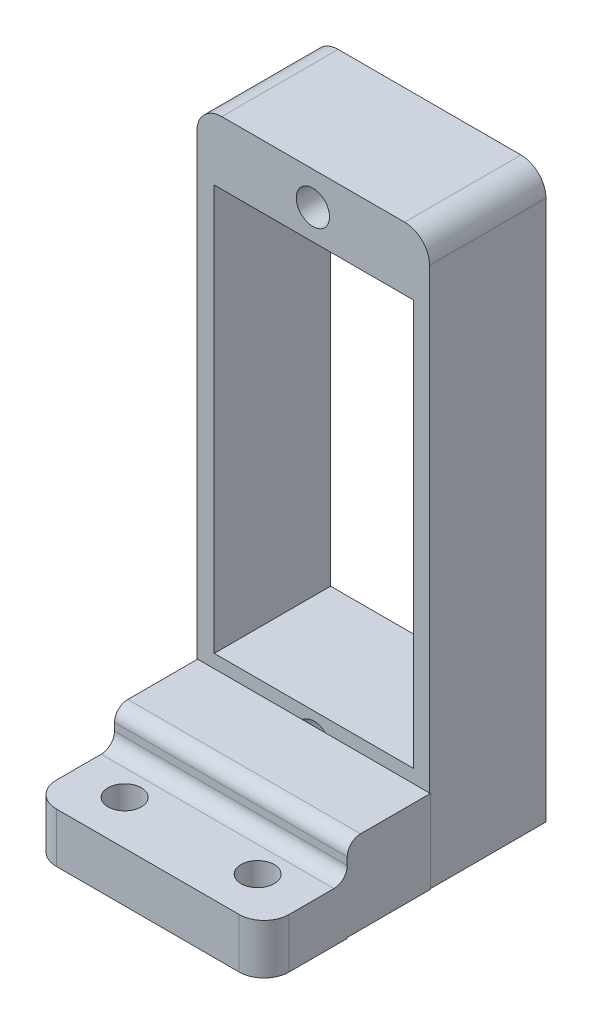
ISO-10303-21;
HEADER;
FILE_DESCRIPTION(('STEP AP214'),'2;1');
FILE_NAME('part.step','',(''),(''),'','','');
FILE_SCHEMA(('AUTOMOTIVE_DESIGN { 1 0 10303 214 1 1 1 1 }'));
ENDSEC;
DATA;
#1=APPLICATION_CONTEXT('core data for automotive mechanical design processes');
#2=APPLICATION_PROTOCOL_DEFINITION('international standard','automotive_design',2000,#1);
#3=PRODUCT_CONTEXT('',#1,'mechanical');
#4=PRODUCT('Part','Part','',(#3));
#5=PRODUCT_RELATED_PRODUCT_CATEGORY('part','',(#4));
#6=PRODUCT_DEFINITION_FORMATION('','',#4);
#7=PRODUCT_DEFINITION_CONTEXT('part definition',#1,'design');
#8=PRODUCT_DEFINITION('design','',#6,#7);
#9=PRODUCT_DEFINITION_SHAPE('','',#8);
#10=(LENGTH_UNIT() NAMED_UNIT(*) SI_UNIT(.MILLI.,.METRE.));
#11=(NAMED_UNIT(*) PLANE_ANGLE_UNIT() SI_UNIT($,.RADIAN.));
#12=(NAMED_UNIT(*) SI_UNIT($,.STERADIAN.) SOLID_ANGLE_UNIT());
#13=UNCERTAINTY_MEASURE_WITH_UNIT(LENGTH_MEASURE(1.E-05),#10,'distance_accuracy_value','');
#14=(GEOMETRIC_REPRESENTATION_CONTEXT(3) GLOBAL_UNCERTAINTY_ASSIGNED_CONTEXT((#13)) GLOBAL_UNIT_ASSIGNED_CONTEXT((#10,
#11,#12)) REPRESENTATION_CONTEXT('',''));
#15=CARTESIAN_POINT('',(0.,0.,0.));
#16=DIRECTION('',(0.,0.,1.));
#17=DIRECTION('',(1.,0.,0.));
#18=AXIS2_PLACEMENT_3D('',#15,#16,#17);
#19=CARTESIAN_POINT('',(231.952994654938,496.99061481828,32.));
#20=DIRECTION('',(1.,0.,0.));
#21=DIRECTION('',(0.,0.,-1.));
#22=AXIS2_PLACEMENT_3D('',#19,#20,#21);
#23=PLANE('',#22);
#24=DIRECTION('',(0.,-1.,0.));
#25=VECTOR('',#24,1.);
#26=CARTESIAN_POINT('',(231.952994654938,496.99061481828,32.));
#27=LINE('',#26,#25);
#28=CARTESIAN_POINT('',(231.952994654938,495.49061481828,32.));
#29=VERTEX_POINT('',#28);
#30=CARTESIAN_POINT('',(231.952994654938,462.99061481828,32.));
#31=VERTEX_POINT('',#30);
#32=EDGE_CURVE('E427',#29,#31,#27,.T.);
#33=ORIENTED_EDGE('',*,*,#32,.F.);
#34=DIRECTION('',(0.,0.,-1.));
#35=VECTOR('',#34,1.);
#36=CARTESIAN_POINT('',(231.952994654938,495.49061481828,32.));
#37=LINE('',#36,#35);
#38=CARTESIAN_POINT('',(231.952994654938,495.49061481828,25.));
#39=VERTEX_POINT('',#38);
#40=EDGE_CURVE('E282',#29,#39,#37,.T.);
#41=ORIENTED_EDGE('',*,*,#40,.T.);
#42=DIRECTION('',(0.,-1.,0.));
#43=VECTOR('',#42,1.);
#44=CARTESIAN_POINT('',(231.952994654938,496.99061481828,25.));
#45=LINE('',#44,#43);
#46=CARTESIAN_POINT('',(231.952994654938,462.99061481828,25.));
#47=VERTEX_POINT('',#46);
#48=EDGE_CURVE('E414',#39,#47,#45,.T.);
#49=ORIENTED_EDGE('',*,*,#48,.T.);
#50=DIRECTION('',(0.,0.,-1.));
#51=VECTOR('',#50,1.);
#52=CARTESIAN_POINT('',(231.952994654938,462.99061481828,32.));
#53=LINE('',#52,#51);
#54=EDGE_CURVE('E246',#31,#47,#53,.T.);
#55=ORIENTED_EDGE('',*,*,#54,.F.);
#56=EDGE_LOOP('',(#33,#41,#49,#55));
#57=FACE_BOUND('',#56,.T.);
#58=ADVANCED_FACE('F39',(#57),#23,.F.);
#59=CARTESIAN_POINT('',(231.952994654938,462.99061481828,32.));
#60=DIRECTION('',(0.,1.,0.));
#61=DIRECTION('',(0.,0.,1.));
#62=AXIS2_PLACEMENT_3D('',#59,#60,#61);
#63=PLANE('',#62);
#64=DIRECTION('',(1.,0.,0.));
#65=VECTOR('',#64,1.);
#66=CARTESIAN_POINT('',(231.952994654938,462.99061481828,25.));
#67=LINE('',#66,#65);
#68=CARTESIAN_POINT('',(245.952994654938,462.99061481828,25.));
#69=VERTEX_POINT('',#68);
#70=EDGE_CURVE('E417',#47,#69,#67,.T.);
#71=ORIENTED_EDGE('',*,*,#70,.T.);
#72=DIRECTION('',(0.,0.,-1.));
#73=VECTOR('',#72,1.);
#74=CARTESIAN_POINT('',(245.952994654938,462.99061481828,32.));
#75=LINE('',#74,#73);
#76=CARTESIAN_POINT('',(245.952994654938,462.99061481828,32.));
#77=VERTEX_POINT('',#76);
#78=EDGE_CURVE('E250',#77,#69,#75,.T.);
#79=ORIENTED_EDGE('',*,*,#78,.F.);
#80=DIRECTION('',(1.,0.,0.));
#81=VECTOR('',#80,1.);
#82=CARTESIAN_POINT('',(231.952994654938,462.99061481828,32.));
#83=LINE('',#82,#81);
#84=EDGE_CURVE('E407',#31,#77,#83,.T.);
#85=ORIENTED_EDGE('',*,*,#84,.F.);
#86=ORIENTED_EDGE('',*,*,#54,.T.);
#87=EDGE_LOOP('',(#71,#79,#85,#86));
#88=FACE_BOUND('',#87,.T.);
#89=ADVANCED_FACE('F561',(#88),#63,.F.);
#90=CARTESIAN_POINT('',(245.952994654938,496.99061481828,32.));
#91=DIRECTION('',(-1.,0.,0.));
#92=DIRECTION('',(0.,0.,1.));
#93=AXIS2_PLACEMENT_3D('',#90,#91,#92);
#94=PLANE('',#93);
#95=DIRECTION('',(0.,1.,0.));
#96=VECTOR('',#95,1.);
#97=CARTESIAN_POINT('',(245.952994654938,496.99061481828,25.));
#98=LINE('',#97,#96);
#99=CARTESIAN_POINT('',(245.952994654938,495.49061481828,25.));
#100=VERTEX_POINT('',#99);
#101=EDGE_CURVE('E421',#69,#100,#98,.T.);
#102=ORIENTED_EDGE('',*,*,#101,.T.);
#103=DIRECTION('',(0.,0.,-1.));
#104=VECTOR('',#103,1.);
#105=CARTESIAN_POINT('',(245.952994654938,495.49061481828,32.));
#106=LINE('',#105,#104);
#107=CARTESIAN_POINT('',(245.952994654938,495.49061481828,32.));
#108=VERTEX_POINT('',#107);
#109=EDGE_CURVE('E305',#100,#108,#106,.F.);
#110=ORIENTED_EDGE('',*,*,#109,.T.);
#111=DIRECTION('',(0.,1.,0.));
#112=VECTOR('',#111,1.);
#113=CARTESIAN_POINT('',(245.952994654938,496.99061481828,32.));
#114=LINE('',#113,#112);
#115=CARTESIAN_POINT('',(245.952994654938,468.,32.));
#116=VERTEX_POINT('',#115);
#117=EDGE_CURVE('E403',#116,#108,#114,.T.);
#118=ORIENTED_EDGE('',*,*,#117,.F.);
#119=CARTESIAN_POINT('',(245.952994654938,463.,32.));
#120=VERTEX_POINT('',#119);
#121=EDGE_CURVE('E398',#120,#116,#114,.T.);
#122=ORIENTED_EDGE('',*,*,#121,.F.);
#123=EDGE_CURVE('E402',#77,#120,#114,.T.);
#124=ORIENTED_EDGE('',*,*,#123,.F.);
#125=ORIENTED_EDGE('',*,*,#78,.T.);
#126=EDGE_LOOP('',(#102,#110,#118,#122,#124,#125));
#127=FACE_BOUND('',#126,.T.);
#128=ADVANCED_FACE('F567',(#127),#94,.F.);
#129=CARTESIAN_POINT('',(231.952994654938,496.99061481828,32.));
#130=DIRECTION('',(0.,-1.,0.));
#131=DIRECTION('',(0.,0.,-1.));
#132=AXIS2_PLACEMENT_3D('',#129,#130,#131);
#133=PLANE('',#132);
#134=DIRECTION('',(-1.,0.,0.));
#135=VECTOR('',#134,1.);
#136=CARTESIAN_POINT('',(231.952994654938,496.99061481828,25.));
#137=LINE('',#136,#135);
#138=CARTESIAN_POINT('',(244.452994654938,496.99061481828,25.));
#139=VERTEX_POINT('',#138);
#140=CARTESIAN_POINT('',(233.452994654938,496.99061481828,25.));
#141=VERTEX_POINT('',#140);
#142=EDGE_CURVE('E424',#139,#141,#137,.T.);
#143=ORIENTED_EDGE('',*,*,#142,.T.);
#144=DIRECTION('',(0.,0.,-1.));
#145=VECTOR('',#144,1.);
#146=CARTESIAN_POINT('',(233.452994654938,496.99061481828,32.));
#147=LINE('',#146,#145);
#148=CARTESIAN_POINT('',(233.452994654938,496.99061481828,32.));
#149=VERTEX_POINT('',#148);
#150=EDGE_CURVE('E296',#141,#149,#147,.F.);
#151=ORIENTED_EDGE('',*,*,#150,.T.);
#152=DIRECTION('',(-1.,0.,0.));
#153=VECTOR('',#152,1.);
#154=CARTESIAN_POINT('',(231.952994654938,496.99061481828,32.));
#155=LINE('',#154,#153);
#156=CARTESIAN_POINT('',(244.452994654938,496.99061481828,32.));
#157=VERTEX_POINT('',#156);
#158=EDGE_CURVE('E257',#157,#149,#155,.T.);
#159=ORIENTED_EDGE('',*,*,#158,.F.);
#160=DIRECTION('',(0.,0.,-1.));
#161=VECTOR('',#160,1.);
#162=CARTESIAN_POINT('',(244.452994654938,496.99061481828,32.));
#163=LINE('',#162,#161);
#164=EDGE_CURVE('E292',#157,#139,#163,.T.);
#165=ORIENTED_EDGE('',*,*,#164,.T.);
#166=EDGE_LOOP('',(#143,#151,#159,#165));
#167=FACE_BOUND('',#166,.T.);
#168=ADVANCED_FACE('F639',(#167),#133,.F.);
#169=CARTESIAN_POINT('',(0.,0.,32.));
#170=DIRECTION('',(0.,0.,1.));
#171=DIRECTION('',(1.,0.,0.));
#172=AXIS2_PLACEMENT_3D('',#169,#170,#171);
#173=PLANE('',#172);
#174=CARTESIAN_POINT('',(238.996354520083,467.272454622162,32.));
#175=DIRECTION('',(0.,0.,-1.));
#176=DIRECTION('',(-1.,0.,0.));
#177=AXIS2_PLACEMENT_3D('',#174,#175,#176);
#178=CIRCLE('',#177,0.999999999999998);
#179=CARTESIAN_POINT('',(238.310294957664,468.,32.));
#180=VERTEX_POINT('',#179);
#181=CARTESIAN_POINT('',(239.682414082501,468.,32.));
#182=VERTEX_POINT('',#181);
#183=EDGE_CURVE('E54',#180,#182,#178,.T.);
#184=ORIENTED_EDGE('',*,*,#183,.T.);
#185=DIRECTION('',(-1.,0.,0.));
#186=VECTOR('',#185,1.);
#187=CARTESIAN_POINT('',(232.,468.,32.));
#188=LINE('',#187,#186);
#189=EDGE_CURVE('E207',#116,#182,#188,.T.);
#190=ORIENTED_EDGE('',*,*,#189,.F.);
#191=ORIENTED_EDGE('',*,*,#117,.T.);
#192=CARTESIAN_POINT('',(244.452994654938,495.49061481828,32.));
#193=DIRECTION('',(0.,0.,1.));
#194=DIRECTION('',(1.,0.,0.));
#195=AXIS2_PLACEMENT_3D('',#192,#193,#194);
#196=CIRCLE('',#195,1.5);
#197=EDGE_CURVE('E299',#108,#157,#196,.T.);
#198=ORIENTED_EDGE('',*,*,#197,.T.);
#199=ORIENTED_EDGE('',*,*,#158,.T.);
#200=CARTESIAN_POINT('',(233.452994654938,495.49061481828,32.));
#201=DIRECTION('',(0.,0.,1.));
#202=DIRECTION('',(1.,0.,0.));
#203=AXIS2_PLACEMENT_3D('',#200,#201,#202);
#204=CIRCLE('',#203,1.5);
#205=EDGE_CURVE('E302',#149,#29,#204,.T.);
#206=ORIENTED_EDGE('',*,*,#205,.T.);
#207=ORIENTED_EDGE('',*,*,#32,.T.);
#208=ORIENTED_EDGE('',*,*,#84,.T.);
#209=ORIENTED_EDGE('',*,*,#123,.T.);
#210=DIRECTION('',(1.,0.,0.));
#211=VECTOR('',#210,1.);
#212=CARTESIAN_POINT('',(232.,463.,32.));
#213=LINE('',#212,#211);
#214=CARTESIAN_POINT('',(232.,463.,32.));
#215=VERTEX_POINT('',#214);
#216=EDGE_CURVE('E244',#215,#120,#213,.T.);
#217=ORIENTED_EDGE('',*,*,#216,.F.);
#218=DIRECTION('',(0.,-1.,0.));
#219=VECTOR('',#218,1.);
#220=CARTESIAN_POINT('',(232.,468.,32.));
#221=LINE('',#220,#219);
#222=CARTESIAN_POINT('',(232.,468.,32.));
#223=VERTEX_POINT('',#222);
#224=EDGE_CURVE('E365',#223,#215,#221,.T.);
#225=ORIENTED_EDGE('',*,*,#224,.F.);
#226=EDGE_CURVE('E208',#180,#223,#188,.T.);
#227=ORIENTED_EDGE('',*,*,#226,.F.);
#228=EDGE_LOOP('',(#184,#190,#191,#198,#199,#206,#207,#208,#209,#217,#225,#227));
#229=FACE_BOUND('',#228,.T.);
#230=DIRECTION('',(0.,-1.,0.));
#231=VECTOR('',#230,1.);
#232=CARTESIAN_POINT('',(233.,493.200012207031,32.));
#233=LINE('',#232,#231);
#234=CARTESIAN_POINT('',(233.,493.200012207031,32.));
#235=VERTEX_POINT('',#234);
#236=CARTESIAN_POINT('',(233.,468.800012207031,32.));
#237=VERTEX_POINT('',#236);
#238=EDGE_CURVE('E443',#235,#237,#233,.T.);
#239=ORIENTED_EDGE('',*,*,#238,.F.);
#240=DIRECTION('',(-1.,0.,0.));
#241=VECTOR('',#240,1.);
#242=CARTESIAN_POINT('',(233.,493.200012207031,32.));
#243=LINE('',#242,#241);
#244=CARTESIAN_POINT('',(245.,493.200012207031,32.));
#245=VERTEX_POINT('',#244);
#246=EDGE_CURVE('E457',#245,#235,#243,.T.);
#247=ORIENTED_EDGE('',*,*,#246,.F.);
#248=DIRECTION('',(0.,1.,0.));
#249=VECTOR('',#248,1.);
#250=CARTESIAN_POINT('',(245.,493.200012207031,32.));
#251=LINE('',#250,#249);
#252=CARTESIAN_POINT('',(245.,468.800012207031,32.));
#253=VERTEX_POINT('',#252);
#254=EDGE_CURVE('E462',#253,#245,#251,.T.);
#255=ORIENTED_EDGE('',*,*,#254,.F.);
#256=DIRECTION('',(1.,0.,0.));
#257=VECTOR('',#256,1.);
#258=CARTESIAN_POINT('',(233.,468.800012207031,32.));
#259=LINE('',#258,#257);
#260=EDGE_CURVE('E466',#237,#253,#259,.T.);
#261=ORIENTED_EDGE('',*,*,#260,.F.);
#262=EDGE_LOOP('',(#239,#247,#255,#261));
#263=FACE_BOUND('',#262,.T.);
#264=CARTESIAN_POINT('',(238.935079191974,495.003072258083,32.));
#265=DIRECTION('',(0.,0.,1.));
#266=DIRECTION('',(1.,0.,0.));
#267=AXIS2_PLACEMENT_3D('',#264,#265,#266);
#268=CIRCLE('',#267,0.999999999999998);
#269=CARTESIAN_POINT('',(239.935079191974,495.003072258083,32.));
#270=VERTEX_POINT('',#269);
#271=EDGE_CURVE('E435',#270,#270,#268,.T.);
#272=ORIENTED_EDGE('',*,*,#271,.F.);
#273=EDGE_LOOP('',(#272));
#274=FACE_BOUND('',#273,.T.);
#275=ADVANCED_FACE('F216',(#229,#263,#274),#173,.T.);
#276=CARTESIAN_POINT('',(0.,0.,25.));
#277=DIRECTION('',(0.,0.,1.));
#278=DIRECTION('',(1.,0.,0.));
#279=AXIS2_PLACEMENT_3D('',#276,#277,#278);
#280=PLANE('',#279);
#281=CARTESIAN_POINT('',(238.996354520083,467.272454622162,25.));
#282=DIRECTION('',(0.,0.,-1.));
#283=DIRECTION('',(-1.,0.,0.));
#284=AXIS2_PLACEMENT_3D('',#281,#282,#283);
#285=CIRCLE('',#284,0.999999999999998);
#286=CARTESIAN_POINT('',(237.996354520083,467.272454622162,25.));
#287=VERTEX_POINT('',#286);
#288=EDGE_CURVE('E213',#287,#287,#285,.T.);
#289=ORIENTED_EDGE('',*,*,#288,.F.);
#290=EDGE_LOOP('',(#289));
#291=FACE_BOUND('',#290,.T.);
#292=DIRECTION('',(-1.,0.,0.));
#293=VECTOR('',#292,1.);
#294=CARTESIAN_POINT('',(233.,493.200012207031,25.));
#295=LINE('',#294,#293);
#296=CARTESIAN_POINT('',(245.,493.200012207031,25.));
#297=VERTEX_POINT('',#296);
#298=CARTESIAN_POINT('',(233.,493.200012207031,25.));
#299=VERTEX_POINT('',#298);
#300=EDGE_CURVE('E449',#297,#299,#295,.T.);
#301=ORIENTED_EDGE('',*,*,#300,.T.);
#302=DIRECTION('',(0.,-1.,0.));
#303=VECTOR('',#302,1.);
#304=CARTESIAN_POINT('',(233.,493.200012207031,25.));
#305=LINE('',#304,#303);
#306=CARTESIAN_POINT('',(233.,468.800012207031,25.));
#307=VERTEX_POINT('',#306);
#308=EDGE_CURVE('E461',#299,#307,#305,.T.);
#309=ORIENTED_EDGE('',*,*,#308,.T.);
#310=DIRECTION('',(1.,0.,0.));
#311=VECTOR('',#310,1.);
#312=CARTESIAN_POINT('',(233.,468.800012207031,25.));
#313=LINE('',#312,#311);
#314=CARTESIAN_POINT('',(245.,468.800012207031,25.));
#315=VERTEX_POINT('',#314);
#316=EDGE_CURVE('E479',#307,#315,#313,.T.);
#317=ORIENTED_EDGE('',*,*,#316,.T.);
#318=DIRECTION('',(0.,1.,0.));
#319=VECTOR('',#318,1.);
#320=CARTESIAN_POINT('',(245.,493.200012207031,25.));
#321=LINE('',#320,#319);
#322=EDGE_CURVE('E475',#315,#297,#321,.T.);
#323=ORIENTED_EDGE('',*,*,#322,.T.);
#324=EDGE_LOOP('',(#301,#309,#317,#323));
#325=FACE_BOUND('',#324,.T.);
#326=CARTESIAN_POINT('',(238.935079191974,495.003072258083,25.));
#327=DIRECTION('',(0.,0.,1.));
#328=DIRECTION('',(1.,0.,0.));
#329=AXIS2_PLACEMENT_3D('',#326,#327,#328);
#330=CIRCLE('',#329,0.999999999999998);
#331=CARTESIAN_POINT('',(239.935079191974,495.003072258083,25.));
#332=VERTEX_POINT('',#331);
#333=EDGE_CURVE('E439',#332,#332,#330,.T.);
#334=ORIENTED_EDGE('',*,*,#333,.T.);
#335=EDGE_LOOP('',(#334));
#336=FACE_BOUND('',#335,.T.);
#337=ORIENTED_EDGE('',*,*,#48,.F.);
#338=CARTESIAN_POINT('',(233.452994654938,495.49061481828,25.));
#339=DIRECTION('',(0.,0.,1.));
#340=DIRECTION('',(1.,0.,0.));
#341=AXIS2_PLACEMENT_3D('',#338,#339,#340);
#342=CIRCLE('',#341,1.5);
#343=EDGE_CURVE('E289',#39,#141,#342,.F.);
#344=ORIENTED_EDGE('',*,*,#343,.T.);
#345=ORIENTED_EDGE('',*,*,#142,.F.);
#346=CARTESIAN_POINT('',(244.452994654938,495.49061481828,25.));
#347=DIRECTION('',(0.,0.,1.));
#348=DIRECTION('',(1.,0.,0.));
#349=AXIS2_PLACEMENT_3D('',#346,#347,#348);
#350=CIRCLE('',#349,1.5);
#351=EDGE_CURVE('E286',#139,#100,#350,.F.);
#352=ORIENTED_EDGE('',*,*,#351,.T.);
#353=ORIENTED_EDGE('',*,*,#101,.F.);
#354=ORIENTED_EDGE('',*,*,#70,.F.);
#355=EDGE_LOOP('',(#337,#344,#345,#352,#353,#354));
#356=FACE_BOUND('',#355,.T.);
#357=ADVANCED_FACE('F635',(#291,#325,#336,#356),#280,.F.);
#358=CARTESIAN_POINT('',(238.935079191974,495.003072258083,25.));
#359=DIRECTION('',(0.,0.,1.));
#360=DIRECTION('',(1.,0.,0.));
#361=AXIS2_PLACEMENT_3D('',#358,#359,#360);
#362=CYLINDRICAL_SURFACE('',#361,0.999999999999998);
#363=CARTESIAN_POINT('',(239.935079191974,495.003072258083,25.));
#364=CARTESIAN_POINT('',(239.935079191974,495.003072258083,25.0729166666667));
#365=CARTESIAN_POINT('',(239.935079191974,495.003072258083,25.1458333333333));
#366=CARTESIAN_POINT('',(239.935079191974,495.003072258083,25.2916666666667));
#367=CARTESIAN_POINT('',(239.935079191974,495.003072258083,25.3645833333333));
#368=CARTESIAN_POINT('',(239.935079191974,495.003072258083,25.5104166666667));
#369=CARTESIAN_POINT('',(239.935079191974,495.003072258083,25.5833333333333));
#370=CARTESIAN_POINT('',(239.935079191974,495.003072258083,25.7291666666667));
#371=CARTESIAN_POINT('',(239.935079191974,495.003072258083,25.8020833333333));
#372=CARTESIAN_POINT('',(239.935079191974,495.003072258083,25.9479166666667));
#373=CARTESIAN_POINT('',(239.935079191974,495.003072258083,26.0208333333333));
#374=CARTESIAN_POINT('',(239.935079191974,495.003072258083,26.1666666666667));
#375=CARTESIAN_POINT('',(239.935079191974,495.003072258083,26.2395833333333));
#376=CARTESIAN_POINT('',(239.935079191974,495.003072258083,26.3854166666667));
#377=CARTESIAN_POINT('',(239.935079191974,495.003072258083,26.4583333333333));
#378=CARTESIAN_POINT('',(239.935079191974,495.003072258083,26.6041666666667));
#379=CARTESIAN_POINT('',(239.935079191974,495.003072258083,26.6770833333333));
#380=CARTESIAN_POINT('',(239.935079191974,495.003072258083,26.8229166666667));
#381=CARTESIAN_POINT('',(239.935079191974,495.003072258083,26.8958333333333));
#382=CARTESIAN_POINT('',(239.935079191974,495.003072258083,27.0416666666667));
#383=CARTESIAN_POINT('',(239.935079191974,495.003072258083,27.1145833333333));
#384=CARTESIAN_POINT('',(239.935079191974,495.003072258083,27.2604166666667));
#385=CARTESIAN_POINT('',(239.935079191974,495.003072258083,27.3333333333333));
#386=CARTESIAN_POINT('',(239.935079191974,495.003072258083,27.4791666666667));
#387=CARTESIAN_POINT('',(239.935079191974,495.003072258083,27.5520833333333));
#388=CARTESIAN_POINT('',(239.935079191974,495.003072258083,27.6979166666667));
#389=CARTESIAN_POINT('',(239.935079191974,495.003072258083,27.7708333333333));
#390=CARTESIAN_POINT('',(239.935079191974,495.003072258083,27.9166666666667));
#391=CARTESIAN_POINT('',(239.935079191974,495.003072258083,27.9895833333333));
#392=CARTESIAN_POINT('',(239.935079191974,495.003072258083,28.1354166666667));
#393=CARTESIAN_POINT('',(239.935079191974,495.003072258083,28.2083333333333));
#394=CARTESIAN_POINT('',(239.935079191974,495.003072258083,28.3541666666667));
#395=CARTESIAN_POINT('',(239.935079191974,495.003072258083,28.4270833333333));
#396=CARTESIAN_POINT('',(239.935079191974,495.003072258083,28.5729166666667));
#397=CARTESIAN_POINT('',(239.935079191974,495.003072258083,28.6458333333333));
#398=CARTESIAN_POINT('',(239.935079191974,495.003072258083,28.7916666666667));
#399=CARTESIAN_POINT('',(239.935079191974,495.003072258083,28.8645833333333));
#400=CARTESIAN_POINT('',(239.935079191974,495.003072258083,29.0104166666667));
#401=CARTESIAN_POINT('',(239.935079191974,495.003072258083,29.0833333333333));
#402=CARTESIAN_POINT('',(239.935079191974,495.003072258083,29.2291666666667));
#403=CARTESIAN_POINT('',(239.935079191974,495.003072258083,29.3020833333333));
#404=CARTESIAN_POINT('',(239.935079191974,495.003072258083,29.4479166666667));
#405=CARTESIAN_POINT('',(239.935079191974,495.003072258083,29.5208333333333));
#406=CARTESIAN_POINT('',(239.935079191974,495.003072258083,29.6666666666667));
#407=CARTESIAN_POINT('',(239.935079191974,495.003072258083,29.7395833333333));
#408=CARTESIAN_POINT('',(239.935079191974,495.003072258083,29.8854166666667));
#409=CARTESIAN_POINT('',(239.935079191974,495.003072258083,29.9583333333333));
#410=CARTESIAN_POINT('',(239.935079191974,495.003072258083,30.1041666666667));
#411=CARTESIAN_POINT('',(239.935079191974,495.003072258083,30.1770833333333));
#412=CARTESIAN_POINT('',(239.935079191974,495.003072258083,30.3229166666667));
#413=CARTESIAN_POINT('',(239.935079191974,495.003072258083,30.3958333333333));
#414=CARTESIAN_POINT('',(239.935079191974,495.003072258083,30.5416666666667));
#415=CARTESIAN_POINT('',(239.935079191974,495.003072258083,30.6145833333333));
#416=CARTESIAN_POINT('',(239.935079191974,495.003072258083,30.7604166666667));
#417=CARTESIAN_POINT('',(239.935079191974,495.003072258083,30.8333333333333));
#418=CARTESIAN_POINT('',(239.935079191974,495.003072258083,30.9791666666667));
#419=CARTESIAN_POINT('',(239.935079191974,495.003072258083,31.0520833333333));
#420=CARTESIAN_POINT('',(239.935079191974,495.003072258083,31.1979166666667));
#421=CARTESIAN_POINT('',(239.935079191974,495.003072258083,31.2708333333333));
#422=CARTESIAN_POINT('',(239.935079191974,495.003072258083,31.4166666666667));
#423=CARTESIAN_POINT('',(239.935079191974,495.003072258083,31.4895833333333));
#424=CARTESIAN_POINT('',(239.935079191974,495.003072258083,31.6354166666667));
#425=CARTESIAN_POINT('',(239.935079191974,495.003072258083,31.7083333333333));
#426=CARTESIAN_POINT('',(239.935079191974,495.003072258083,31.8541666666667));
#427=CARTESIAN_POINT('',(239.935079191974,495.003072258083,31.9270833333333));
#428=CARTESIAN_POINT('',(239.935079191974,495.003072258083,32.));
#429=B_SPLINE_CURVE_WITH_KNOTS('',3,(#363,#364,#365,#366,#367,#368,#369,#370,#371,#372,#373,
#374,#375,#376,#377,#378,#379,#380,#381,#382,#383,#384,#385,#386,#387,#388,#389,#390,#391,#392,
#393,#394,#395,#396,#397,#398,#399,#400,#401,#402,#403,#404,#405,#406,#407,#408,#409,#410,#411,
#412,#413,#414,#415,#416,#417,#418,#419,#420,#421,#422,#423,#424,#425,#426,#427,#428),
.UNSPECIFIED.,.F.,.F.,(4,2,2,2,2,2,2,2,2,2,2,2,2,2,2,2,2,2,2,2,2,2,2,2,2,2,2,2,2,2,2,2,4),(0.,
0.218749999999997,0.437499999999997,0.656249999999997,0.874999999999997,1.09375,1.3125,1.53125,
1.75,1.96875,2.1875,2.40625,2.625,2.84375,3.0625,3.28125,3.5,3.71875,3.9375,4.15625,4.375,
4.59374999999999,4.8125,5.03124999999999,5.24999999999999,5.46874999999999,5.68749999999999,
5.90624999999999,6.12499999999999,6.34375,6.56249999999999,6.78125,6.99999999999999),.UNSPECIFIED.);
#430=EDGE_CURVE('BSEAM631',#332,#270,#429,.T.);
#431=ORIENTED_EDGE('',*,*,#333,.F.);
#432=ORIENTED_EDGE('',*,*,#271,.T.);
#433=ORIENTED_EDGE('',*,*,#430,.T.);
#434=ORIENTED_EDGE('',*,*,#430,.F.);
#435=EDGE_LOOP('',(#431,#433,#432,#434));
#436=FACE_BOUND('',#435,.T.);
#437=ADVANCED_FACE('F631',(#436),#362,.F.);
#438=CARTESIAN_POINT('',(233.,493.200012207031,25.));
#439=DIRECTION('',(-1.,0.,0.));
#440=DIRECTION('',(0.,0.,1.));
#441=AXIS2_PLACEMENT_3D('',#438,#439,#440);
#442=PLANE('',#441);
#443=ORIENTED_EDGE('',*,*,#238,.T.);
#444=DIRECTION('',(0.,0.,1.));
#445=VECTOR('',#444,1.);
#446=CARTESIAN_POINT('',(233.,468.800012207031,25.));
#447=LINE('',#446,#445);
#448=EDGE_CURVE('E444',#307,#237,#447,.T.);
#449=ORIENTED_EDGE('',*,*,#448,.F.);
#450=ORIENTED_EDGE('',*,*,#308,.F.);
#451=DIRECTION('',(0.,0.,1.));
#452=VECTOR('',#451,1.);
#453=CARTESIAN_POINT('',(233.,493.200012207031,25.));
#454=LINE('',#453,#452);
#455=EDGE_CURVE('E418',#299,#235,#454,.T.);
#456=ORIENTED_EDGE('',*,*,#455,.T.);
#457=EDGE_LOOP('',(#443,#449,#450,#456));
#458=FACE_BOUND('',#457,.T.);
#459=ADVANCED_FACE('F621',(#458),#442,.F.);
#460=CARTESIAN_POINT('',(233.,493.200012207031,25.));
#461=DIRECTION('',(0.,1.,0.));
#462=DIRECTION('',(0.,0.,1.));
#463=AXIS2_PLACEMENT_3D('',#460,#461,#462);
#464=PLANE('',#463);
#465=ORIENTED_EDGE('',*,*,#246,.T.);
#466=ORIENTED_EDGE('',*,*,#455,.F.);
#467=ORIENTED_EDGE('',*,*,#300,.F.);
#468=DIRECTION('',(0.,0.,1.));
#469=VECTOR('',#468,1.);
#470=CARTESIAN_POINT('',(245.,493.200012207031,25.));
#471=LINE('',#470,#469);
#472=EDGE_CURVE('E452',#297,#245,#471,.T.);
#473=ORIENTED_EDGE('',*,*,#472,.T.);
#474=EDGE_LOOP('',(#465,#466,#467,#473));
#475=FACE_BOUND('',#474,.T.);
#476=ADVANCED_FACE('F617',(#475),#464,.F.);
#477=CARTESIAN_POINT('',(245.,493.200012207031,25.));
#478=DIRECTION('',(1.,0.,0.));
#479=DIRECTION('',(0.,0.,-1.));
#480=AXIS2_PLACEMENT_3D('',#477,#478,#479);
#481=PLANE('',#480);
#482=ORIENTED_EDGE('',*,*,#254,.T.);
#483=ORIENTED_EDGE('',*,*,#472,.F.);
#484=ORIENTED_EDGE('',*,*,#322,.F.);
#485=DIRECTION('',(0.,0.,1.));
#486=VECTOR('',#485,1.);
#487=CARTESIAN_POINT('',(245.,468.800012207031,25.));
#488=LINE('',#487,#486);
#489=EDGE_CURVE('E448',#315,#253,#488,.T.);
#490=ORIENTED_EDGE('',*,*,#489,.T.);
#491=EDGE_LOOP('',(#482,#483,#484,#490));
#492=FACE_BOUND('',#491,.T.);
#493=ADVANCED_FACE('F620',(#492),#481,.F.);
#494=CARTESIAN_POINT('',(233.,468.800012207031,25.));
#495=DIRECTION('',(0.,-1.,0.));
#496=DIRECTION('',(0.,0.,-1.));
#497=AXIS2_PLACEMENT_3D('',#494,#495,#496);
#498=PLANE('',#497);
#499=ORIENTED_EDGE('',*,*,#260,.T.);
#500=ORIENTED_EDGE('',*,*,#489,.F.);
#501=ORIENTED_EDGE('',*,*,#316,.F.);
#502=ORIENTED_EDGE('',*,*,#448,.T.);
#503=EDGE_LOOP('',(#499,#500,#501,#502));
#504=FACE_BOUND('',#503,.T.);
#505=ADVANCED_FACE('F608',(#504),#498,.F.);
#506=CARTESIAN_POINT('',(0.,0.,32.));
#507=DIRECTION('',(0.,0.,1.));
#508=DIRECTION('',(1.,0.,0.));
#509=AXIS2_PLACEMENT_3D('',#506,#507,#508);
#510=PLANE('',#509);
#511=CARTESIAN_POINT('',(246.,463.,32.));
#512=VERTEX_POINT('',#511);
#513=EDGE_CURVE('E376',#120,#512,#213,.T.);
#514=ORIENTED_EDGE('',*,*,#513,.F.);
#515=ORIENTED_EDGE('',*,*,#121,.T.);
#516=CARTESIAN_POINT('',(246.,468.,32.));
#517=VERTEX_POINT('',#516);
#518=EDGE_CURVE('E226',#517,#116,#188,.T.);
#519=ORIENTED_EDGE('',*,*,#518,.F.);
#520=DIRECTION('',(0.,1.,0.));
#521=VECTOR('',#520,1.);
#522=CARTESIAN_POINT('',(246.,468.,32.));
#523=LINE('',#522,#521);
#524=EDGE_CURVE('E237',#512,#517,#523,.T.);
#525=ORIENTED_EDGE('',*,*,#524,.F.);
#526=EDGE_LOOP('',(#514,#515,#519,#525));
#527=FACE_BOUND('',#526,.T.);
#528=ADVANCED_FACE('F396',(#527),#510,.F.);
#529=CARTESIAN_POINT('',(232.,468.,37.));
#530=DIRECTION('',(1.,0.,0.));
#531=DIRECTION('',(0.,0.,-1.));
#532=AXIS2_PLACEMENT_3D('',#529,#530,#531);
#533=PLANE('',#532);
#534=DIRECTION('',(0.,-1.,0.));
#535=VECTOR('',#534,1.);
#536=CARTESIAN_POINT('',(232.,468.,37.));
#537=LINE('',#536,#535);
#538=CARTESIAN_POINT('',(232.,467.2,37.));
#539=VERTEX_POINT('',#538);
#540=CARTESIAN_POINT('',(232.,466.746662177277,37.));
#541=VERTEX_POINT('',#540);
#542=EDGE_CURVE('E236',#539,#541,#537,.T.);
#543=ORIENTED_EDGE('',*,*,#542,.F.);
#544=CARTESIAN_POINT('',(232.,467.2,36.2));
#545=DIRECTION('',(1.,0.,0.));
#546=DIRECTION('',(0.,0.,-1.));
#547=AXIS2_PLACEMENT_3D('',#544,#545,#546);
#548=CIRCLE('',#547,0.8);
#549=CARTESIAN_POINT('',(232.,468.,36.2));
#550=VERTEX_POINT('',#549);
#551=EDGE_CURVE('E319',#539,#550,#548,.F.);
#552=ORIENTED_EDGE('',*,*,#551,.T.);
#553=DIRECTION('',(0.,0.,-1.));
#554=VECTOR('',#553,1.);
#555=CARTESIAN_POINT('',(232.,468.,37.));
#556=LINE('',#555,#554);
#557=EDGE_CURVE('E372',#550,#223,#556,.T.);
#558=ORIENTED_EDGE('',*,*,#557,.T.);
#559=ORIENTED_EDGE('',*,*,#224,.T.);
#560=DIRECTION('',(0.,0.,-1.));
#561=VECTOR('',#560,1.);
#562=CARTESIAN_POINT('',(232.,463.,37.));
#563=LINE('',#562,#561);
#564=CARTESIAN_POINT('',(232.,463.,37.));
#565=VERTEX_POINT('',#564);
#566=EDGE_CURVE('E393',#565,#215,#563,.T.);
#567=ORIENTED_EDGE('',*,*,#566,.F.);
#568=DIRECTION('',(0.,-1.,0.));
#569=VECTOR('',#568,1.);
#570=CARTESIAN_POINT('',(232.,465.946662177277,37.));
#571=LINE('',#570,#569);
#572=CARTESIAN_POINT('',(232.,462.946662177277,37.));
#573=VERTEX_POINT('',#572);
#574=EDGE_CURVE('E222',#565,#573,#571,.T.);
#575=ORIENTED_EDGE('',*,*,#574,.T.);
#576=DIRECTION('',(0.,0.,-1.));
#577=VECTOR('',#576,1.);
#578=CARTESIAN_POINT('',(232.,462.946662177277,42.));
#579=LINE('',#578,#577);
#580=CARTESIAN_POINT('',(232.,462.946662177277,40.5));
#581=VERTEX_POINT('',#580);
#582=EDGE_CURVE('E358',#581,#573,#579,.T.);
#583=ORIENTED_EDGE('',*,*,#582,.F.);
#584=DIRECTION('',(0.,-1.,0.));
#585=VECTOR('',#584,1.);
#586=CARTESIAN_POINT('',(232.,465.946662177277,40.5));
#587=LINE('',#586,#585);
#588=CARTESIAN_POINT('',(232.,465.946662177277,40.5));
#589=VERTEX_POINT('',#588);
#590=EDGE_CURVE('E270',#581,#589,#587,.F.);
#591=ORIENTED_EDGE('',*,*,#590,.T.);
#592=DIRECTION('',(0.,0.,-1.));
#593=VECTOR('',#592,1.);
#594=CARTESIAN_POINT('',(232.,465.946662177277,42.));
#595=LINE('',#594,#593);
#596=CARTESIAN_POINT('',(232.,465.946662177277,37.8));
#597=VERTEX_POINT('',#596);
#598=EDGE_CURVE('E332',#589,#597,#595,.T.);
#599=ORIENTED_EDGE('',*,*,#598,.T.);
#600=CARTESIAN_POINT('',(232.,466.746662177277,37.8));
#601=DIRECTION('',(1.,0.,0.));
#602=DIRECTION('',(0.,0.,-1.));
#603=AXIS2_PLACEMENT_3D('',#600,#601,#602);
#604=CIRCLE('',#603,0.8);
#605=EDGE_CURVE('E48',#597,#541,#604,.T.);
#606=ORIENTED_EDGE('',*,*,#605,.T.);
#607=EDGE_LOOP('',(#543,#552,#558,#559,#567,#575,#583,#591,#599,#606));
#608=FACE_BOUND('',#607,.T.);
#609=ADVANCED_FACE('F330',(#608),#533,.F.);
#610=CARTESIAN_POINT('',(232.,463.,37.));
#611=DIRECTION('',(0.,1.,0.));
#612=DIRECTION('',(0.,0.,1.));
#613=AXIS2_PLACEMENT_3D('',#610,#611,#612);
#614=PLANE('',#613);
#615=ORIENTED_EDGE('',*,*,#216,.T.);
#616=ORIENTED_EDGE('',*,*,#513,.T.);
#617=DIRECTION('',(0.,0.,-1.));
#618=VECTOR('',#617,1.);
#619=CARTESIAN_POINT('',(246.,463.,37.));
#620=LINE('',#619,#618);
#621=CARTESIAN_POINT('',(246.,463.,37.));
#622=VERTEX_POINT('',#621);
#623=EDGE_CURVE('E385',#622,#512,#620,.T.);
#624=ORIENTED_EDGE('',*,*,#623,.F.);
#625=DIRECTION('',(1.,0.,0.));
#626=VECTOR('',#625,1.);
#627=CARTESIAN_POINT('',(232.,463.,37.));
#628=LINE('',#627,#626);
#629=EDGE_CURVE('E241',#565,#622,#628,.T.);
#630=ORIENTED_EDGE('',*,*,#629,.F.);
#631=ORIENTED_EDGE('',*,*,#566,.T.);
#632=EDGE_LOOP('',(#615,#616,#624,#630,#631));
#633=FACE_BOUND('',#632,.T.);
#634=ADVANCED_FACE('F384',(#633),#614,.F.);
#635=CARTESIAN_POINT('',(246.,468.,37.));
#636=DIRECTION('',(-1.,0.,0.));
#637=DIRECTION('',(0.,0.,1.));
#638=AXIS2_PLACEMENT_3D('',#635,#636,#637);
#639=PLANE('',#638);
#640=DIRECTION('',(0.,0.,-1.));
#641=VECTOR('',#640,1.);
#642=CARTESIAN_POINT('',(246.,468.,37.));
#643=LINE('',#642,#641);
#644=CARTESIAN_POINT('',(246.,468.,36.2));
#645=VERTEX_POINT('',#644);
#646=EDGE_CURVE('E394',#645,#517,#643,.T.);
#647=ORIENTED_EDGE('',*,*,#646,.F.);
#648=CARTESIAN_POINT('',(246.,467.2,36.2));
#649=DIRECTION('',(-1.,0.,0.));
#650=DIRECTION('',(0.,0.,1.));
#651=AXIS2_PLACEMENT_3D('',#648,#649,#650);
#652=CIRCLE('',#651,0.8);
#653=CARTESIAN_POINT('',(246.,467.2,37.));
#654=VERTEX_POINT('',#653);
#655=EDGE_CURVE('E324',#645,#654,#652,.F.);
#656=ORIENTED_EDGE('',*,*,#655,.T.);
#657=DIRECTION('',(0.,1.,0.));
#658=VECTOR('',#657,1.);
#659=CARTESIAN_POINT('',(246.,468.,37.));
#660=LINE('',#659,#658);
#661=CARTESIAN_POINT('',(246.,466.746662177277,37.));
#662=VERTEX_POINT('',#661);
#663=EDGE_CURVE('E349',#662,#654,#660,.T.);
#664=ORIENTED_EDGE('',*,*,#663,.F.);
#665=CARTESIAN_POINT('',(246.,466.746662177277,37.8));
#666=DIRECTION('',(-1.,0.,0.));
#667=DIRECTION('',(0.,0.,1.));
#668=AXIS2_PLACEMENT_3D('',#665,#666,#667);
#669=CIRCLE('',#668,0.8);
#670=CARTESIAN_POINT('',(246.,465.946662177277,37.8));
#671=VERTEX_POINT('',#670);
#672=EDGE_CURVE('E11',#662,#671,#669,.T.);
#673=ORIENTED_EDGE('',*,*,#672,.T.);
#674=DIRECTION('',(0.,0.,-1.));
#675=VECTOR('',#674,1.);
#676=CARTESIAN_POINT('',(246.,465.946662177277,42.));
#677=LINE('',#676,#675);
#678=CARTESIAN_POINT('',(246.,465.946662177277,40.5));
#679=VERTEX_POINT('',#678);
#680=EDGE_CURVE('E347',#679,#671,#677,.T.);
#681=ORIENTED_EDGE('',*,*,#680,.F.);
#682=DIRECTION('',(0.,1.,0.));
#683=VECTOR('',#682,1.);
#684=CARTESIAN_POINT('',(246.,462.946662177277,40.5));
#685=LINE('',#684,#683);
#686=CARTESIAN_POINT('',(246.,462.946662177277,40.5));
#687=VERTEX_POINT('',#686);
#688=EDGE_CURVE('E279',#679,#687,#685,.F.);
#689=ORIENTED_EDGE('',*,*,#688,.T.);
#690=DIRECTION('',(0.,0.,-1.));
#691=VECTOR('',#690,1.);
#692=CARTESIAN_POINT('',(246.,462.946662177277,42.));
#693=LINE('',#692,#691);
#694=CARTESIAN_POINT('',(246.,462.946662177277,37.));
#695=VERTEX_POINT('',#694);
#696=EDGE_CURVE('E354',#687,#695,#693,.T.);
#697=ORIENTED_EDGE('',*,*,#696,.T.);
#698=DIRECTION('',(0.,1.,0.));
#699=VECTOR('',#698,1.);
#700=CARTESIAN_POINT('',(246.,465.946662177277,37.));
#701=LINE('',#700,#699);
#702=EDGE_CURVE('E391',#695,#622,#701,.T.);
#703=ORIENTED_EDGE('',*,*,#702,.T.);
#704=ORIENTED_EDGE('',*,*,#623,.T.);
#705=ORIENTED_EDGE('',*,*,#524,.T.);
#706=EDGE_LOOP('',(#647,#656,#664,#673,#681,#689,#697,#703,#704,#705));
#707=FACE_BOUND('',#706,.T.);
#708=ADVANCED_FACE('F346',(#707),#639,.F.);
#709=CARTESIAN_POINT('',(232.,468.,37.));
#710=DIRECTION('',(0.,-1.,0.));
#711=DIRECTION('',(0.,0.,-1.));
#712=AXIS2_PLACEMENT_3D('',#709,#710,#711);
#713=PLANE('',#712);
#714=ORIENTED_EDGE('',*,*,#557,.F.);
#715=DIRECTION('',(-1.,0.,0.));
#716=VECTOR('',#715,1.);
#717=CARTESIAN_POINT('',(246.,468.,36.2));
#718=LINE('',#717,#716);
#719=EDGE_CURVE('E62',#550,#645,#718,.F.);
#720=ORIENTED_EDGE('',*,*,#719,.T.);
#721=ORIENTED_EDGE('',*,*,#646,.T.);
#722=ORIENTED_EDGE('',*,*,#518,.T.);
#723=ORIENTED_EDGE('',*,*,#189,.T.);
#724=EDGE_CURVE('E201',#182,#180,#188,.T.);
#725=ORIENTED_EDGE('',*,*,#724,.T.);
#726=ORIENTED_EDGE('',*,*,#226,.T.);
#727=EDGE_LOOP('',(#714,#720,#721,#722,#723,#725,#726));
#728=FACE_BOUND('',#727,.T.);
#729=ADVANCED_FACE('F224',(#728),#713,.F.);
#730=CARTESIAN_POINT('',(0.,0.,37.));
#731=DIRECTION('',(0.,0.,1.));
#732=DIRECTION('',(1.,0.,0.));
#733=AXIS2_PLACEMENT_3D('',#730,#731,#732);
#734=PLANE('',#733);
#735=ORIENTED_EDGE('',*,*,#542,.T.);
#736=DIRECTION('',(-1.,0.,0.));
#737=VECTOR('',#736,1.);
#738=CARTESIAN_POINT('',(0.,466.746662177277,37.));
#739=LINE('',#738,#737);
#740=EDGE_CURVE('E316',#541,#662,#739,.F.);
#741=ORIENTED_EDGE('',*,*,#740,.T.);
#742=ORIENTED_EDGE('',*,*,#663,.T.);
#743=DIRECTION('',(-1.,0.,0.));
#744=VECTOR('',#743,1.);
#745=CARTESIAN_POINT('',(232.,467.2,37.));
#746=LINE('',#745,#744);
#747=EDGE_CURVE('E312',#654,#539,#746,.T.);
#748=ORIENTED_EDGE('',*,*,#747,.T.);
#749=EDGE_LOOP('',(#735,#741,#742,#748));
#750=FACE_BOUND('',#749,.T.);
#751=ADVANCED_FACE('F337',(#750),#734,.T.);
#752=CARTESIAN_POINT('',(0.,0.,37.));
#753=DIRECTION('',(0.,0.,1.));
#754=DIRECTION('',(1.,0.,0.));
#755=AXIS2_PLACEMENT_3D('',#752,#753,#754);
#756=PLANE('',#755);
#757=ORIENTED_EDGE('',*,*,#574,.F.);
#758=ORIENTED_EDGE('',*,*,#629,.T.);
#759=ORIENTED_EDGE('',*,*,#702,.F.);
#760=DIRECTION('',(1.,0.,0.));
#761=VECTOR('',#760,1.);
#762=CARTESIAN_POINT('',(232.,462.946662177277,37.));
#763=LINE('',#762,#761);
#764=EDGE_CURVE('E498',#573,#695,#763,.T.);
#765=ORIENTED_EDGE('',*,*,#764,.F.);
#766=EDGE_LOOP('',(#757,#758,#759,#765));
#767=FACE_BOUND('',#766,.T.);
#768=ADVANCED_FACE('F496',(#767),#756,.F.);
#769=CARTESIAN_POINT('',(232.,462.946662177277,42.));
#770=DIRECTION('',(0.,1.,0.));
#771=DIRECTION('',(0.,0.,1.));
#772=AXIS2_PLACEMENT_3D('',#769,#770,#771);
#773=PLANE('',#772);
#774=CARTESIAN_POINT('',(234.951502539022,462.946662177277,39.3412252333563));
#775=DIRECTION('',(0.,1.,0.));
#776=DIRECTION('',(0.,0.,1.));
#777=AXIS2_PLACEMENT_3D('',#774,#775,#776);
#778=CIRCLE('',#777,0.999999999999998);
#779=CARTESIAN_POINT('',(234.951502539022,462.946662177277,40.3412252333563));
#780=VERTEX_POINT('',#779);
#781=EDGE_CURVE('E517',#780,#780,#778,.T.);
#782=ORIENTED_EDGE('',*,*,#781,.T.);
#783=EDGE_LOOP('',(#782));
#784=FACE_BOUND('',#783,.T.);
#785=CARTESIAN_POINT('',(242.951502539022,462.946662177277,39.3412252333563));
#786=DIRECTION('',(0.,1.,0.));
#787=DIRECTION('',(0.,0.,1.));
#788=AXIS2_PLACEMENT_3D('',#785,#786,#787);
#789=CIRCLE('',#788,0.999999999999998);
#790=CARTESIAN_POINT('',(242.951502539022,462.946662177277,40.3412252333563));
#791=VERTEX_POINT('',#790);
#792=EDGE_CURVE('E523',#791,#791,#789,.T.);
#793=ORIENTED_EDGE('',*,*,#792,.T.);
#794=EDGE_LOOP('',(#793));
#795=FACE_BOUND('',#794,.T.);
#796=DIRECTION('',(1.,0.,0.));
#797=VECTOR('',#796,1.);
#798=CARTESIAN_POINT('',(232.,462.946662177277,42.));
#799=LINE('',#798,#797);
#800=CARTESIAN_POINT('',(233.5,462.946662177277,42.));
#801=VERTEX_POINT('',#800);
#802=CARTESIAN_POINT('',(244.5,462.946662177277,42.));
#803=VERTEX_POINT('',#802);
#804=EDGE_CURVE('E506',#801,#803,#799,.T.);
#805=ORIENTED_EDGE('',*,*,#804,.F.);
#806=CARTESIAN_POINT('',(233.5,462.946662177277,40.5));
#807=DIRECTION('',(0.,1.,0.));
#808=DIRECTION('',(0.,0.,1.));
#809=AXIS2_PLACEMENT_3D('',#806,#807,#808);
#810=CIRCLE('',#809,1.5);
#811=EDGE_CURVE('E267',#801,#581,#810,.F.);
#812=ORIENTED_EDGE('',*,*,#811,.T.);
#813=ORIENTED_EDGE('',*,*,#582,.T.);
#814=ORIENTED_EDGE('',*,*,#764,.T.);
#815=ORIENTED_EDGE('',*,*,#696,.F.);
#816=CARTESIAN_POINT('',(244.5,462.946662177277,40.5));
#817=DIRECTION('',(0.,1.,0.));
#818=DIRECTION('',(0.,0.,1.));
#819=AXIS2_PLACEMENT_3D('',#816,#817,#818);
#820=CIRCLE('',#819,1.5);
#821=EDGE_CURVE('E264',#687,#803,#820,.F.);
#822=ORIENTED_EDGE('',*,*,#821,.T.);
#823=EDGE_LOOP('',(#805,#812,#813,#814,#815,#822));
#824=FACE_BOUND('',#823,.T.);
#825=ADVANCED_FACE('F535',(#784,#795,#824),#773,.F.);
#826=CARTESIAN_POINT('',(232.,465.946662177277,42.));
#827=DIRECTION('',(0.,-1.,0.));
#828=DIRECTION('',(0.,0.,-1.));
#829=AXIS2_PLACEMENT_3D('',#826,#827,#828);
#830=PLANE('',#829);
#831=CARTESIAN_POINT('',(234.951502539022,465.946662177277,39.3412252333563));
#832=DIRECTION('',(0.,1.,0.));
#833=DIRECTION('',(0.,0.,1.));
#834=AXIS2_PLACEMENT_3D('',#831,#832,#833);
#835=CIRCLE('',#834,0.999999999999998);
#836=CARTESIAN_POINT('',(234.951502539022,465.946662177277,40.3412252333563));
#837=VERTEX_POINT('',#836);
#838=EDGE_CURVE('E527',#837,#837,#835,.T.);
#839=ORIENTED_EDGE('',*,*,#838,.F.);
#840=EDGE_LOOP('',(#839));
#841=FACE_BOUND('',#840,.T.);
#842=CARTESIAN_POINT('',(242.951502539022,465.946662177277,39.3412252333563));
#843=DIRECTION('',(0.,1.,0.));
#844=DIRECTION('',(0.,0.,1.));
#845=AXIS2_PLACEMENT_3D('',#842,#843,#844);
#846=CIRCLE('',#845,0.999999999999998);
#847=CARTESIAN_POINT('',(242.951502539022,465.946662177277,40.3412252333563));
#848=VERTEX_POINT('',#847);
#849=EDGE_CURVE('E519',#848,#848,#846,.T.);
#850=ORIENTED_EDGE('',*,*,#849,.F.);
#851=EDGE_LOOP('',(#850));
#852=FACE_BOUND('',#851,.T.);
#853=ORIENTED_EDGE('',*,*,#680,.T.);
#854=DIRECTION('',(-1.,0.,0.));
#855=VECTOR('',#854,1.);
#856=CARTESIAN_POINT('',(232.,465.946662177277,37.8));
#857=LINE('',#856,#855);
#858=EDGE_CURVE('E308',#671,#597,#857,.T.);
#859=ORIENTED_EDGE('',*,*,#858,.T.);
#860=ORIENTED_EDGE('',*,*,#598,.F.);
#861=CARTESIAN_POINT('',(233.5,465.946662177277,40.5));
#862=DIRECTION('',(0.,-1.,0.));
#863=DIRECTION('',(0.,0.,-1.));
#864=AXIS2_PLACEMENT_3D('',#861,#862,#863);
#865=CIRCLE('',#864,1.5);
#866=CARTESIAN_POINT('',(233.5,465.946662177277,42.));
#867=VERTEX_POINT('',#866);
#868=EDGE_CURVE('E276',#589,#867,#865,.F.);
#869=ORIENTED_EDGE('',*,*,#868,.T.);
#870=DIRECTION('',(-1.,0.,0.));
#871=VECTOR('',#870,1.);
#872=CARTESIAN_POINT('',(232.,465.946662177277,42.));
#873=LINE('',#872,#871);
#874=CARTESIAN_POINT('',(244.5,465.946662177277,42.));
#875=VERTEX_POINT('',#874);
#876=EDGE_CURVE('E360',#875,#867,#873,.T.);
#877=ORIENTED_EDGE('',*,*,#876,.F.);
#878=CARTESIAN_POINT('',(244.5,465.946662177277,40.5));
#879=DIRECTION('',(0.,-1.,0.));
#880=DIRECTION('',(0.,0.,-1.));
#881=AXIS2_PLACEMENT_3D('',#878,#879,#880);
#882=CIRCLE('',#881,1.5);
#883=EDGE_CURVE('E273',#875,#679,#882,.F.);
#884=ORIENTED_EDGE('',*,*,#883,.T.);
#885=EDGE_LOOP('',(#853,#859,#860,#869,#877,#884));
#886=FACE_BOUND('',#885,.T.);
#887=ADVANCED_FACE('F351',(#841,#852,#886),#830,.F.);
#888=CARTESIAN_POINT('',(0.,0.,42.));
#889=DIRECTION('',(0.,0.,1.));
#890=DIRECTION('',(1.,0.,0.));
#891=AXIS2_PLACEMENT_3D('',#888,#889,#890);
#892=PLANE('',#891);
#893=ORIENTED_EDGE('',*,*,#876,.T.);
#894=DIRECTION('',(0.,-1.,0.));
#895=VECTOR('',#894,1.);
#896=CARTESIAN_POINT('',(233.5,462.946662177277,42.));
#897=LINE('',#896,#895);
#898=EDGE_CURVE('E231',#867,#801,#897,.T.);
#899=ORIENTED_EDGE('',*,*,#898,.T.);
#900=ORIENTED_EDGE('',*,*,#804,.T.);
#901=DIRECTION('',(0.,1.,0.));
#902=VECTOR('',#901,1.);
#903=CARTESIAN_POINT('',(244.5,465.946662177277,42.));
#904=LINE('',#903,#902);
#905=EDGE_CURVE('E228',#803,#875,#904,.T.);
#906=ORIENTED_EDGE('',*,*,#905,.T.);
#907=EDGE_LOOP('',(#893,#899,#900,#906));
#908=FACE_BOUND('',#907,.T.);
#909=ADVANCED_FACE('F547',(#908),#892,.T.);
#910=CARTESIAN_POINT('',(233.5,0.,40.5));
#911=DIRECTION('',(0.,1.,0.));
#912=DIRECTION('',(0.,0.,1.));
#913=AXIS2_PLACEMENT_3D('',#910,#911,#912);
#914=CYLINDRICAL_SURFACE('',#913,1.5);
#915=ORIENTED_EDGE('',*,*,#868,.F.);
#916=ORIENTED_EDGE('',*,*,#590,.F.);
#917=ORIENTED_EDGE('',*,*,#811,.F.);
#918=ORIENTED_EDGE('',*,*,#898,.F.);
#919=EDGE_LOOP('',(#915,#916,#917,#918));
#920=FACE_BOUND('',#919,.T.);
#921=ADVANCED_FACE('F571',(#920),#914,.T.);
#922=CARTESIAN_POINT('',(244.5,0.,40.5));
#923=DIRECTION('',(0.,-1.,0.));
#924=DIRECTION('',(0.,0.,-1.));
#925=AXIS2_PLACEMENT_3D('',#922,#923,#924);
#926=CYLINDRICAL_SURFACE('',#925,1.5);
#927=ORIENTED_EDGE('',*,*,#821,.F.);
#928=ORIENTED_EDGE('',*,*,#688,.F.);
#929=ORIENTED_EDGE('',*,*,#883,.F.);
#930=ORIENTED_EDGE('',*,*,#905,.F.);
#931=EDGE_LOOP('',(#927,#928,#929,#930));
#932=FACE_BOUND('',#931,.T.);
#933=ADVANCED_FACE('F574',(#932),#926,.T.);
#934=CARTESIAN_POINT('',(233.452994654938,495.49061481828,32.));
#935=DIRECTION('',(0.,0.,-1.));
#936=DIRECTION('',(-1.,0.,0.));
#937=AXIS2_PLACEMENT_3D('',#934,#935,#936);
#938=CYLINDRICAL_SURFACE('',#937,1.5);
#939=ORIENTED_EDGE('',*,*,#205,.F.);
#940=ORIENTED_EDGE('',*,*,#150,.F.);
#941=ORIENTED_EDGE('',*,*,#343,.F.);
#942=ORIENTED_EDGE('',*,*,#40,.F.);
#943=EDGE_LOOP('',(#939,#940,#941,#942));
#944=FACE_BOUND('',#943,.T.);
#945=ADVANCED_FACE('F578',(#944),#938,.T.);
#946=CARTESIAN_POINT('',(244.452994654938,495.49061481828,32.));
#947=DIRECTION('',(0.,0.,-1.));
#948=DIRECTION('',(-1.,0.,0.));
#949=AXIS2_PLACEMENT_3D('',#946,#947,#948);
#950=CYLINDRICAL_SURFACE('',#949,1.5);
#951=ORIENTED_EDGE('',*,*,#197,.F.);
#952=ORIENTED_EDGE('',*,*,#109,.F.);
#953=ORIENTED_EDGE('',*,*,#351,.F.);
#954=ORIENTED_EDGE('',*,*,#164,.F.);
#955=EDGE_LOOP('',(#951,#952,#953,#954));
#956=FACE_BOUND('',#955,.T.);
#957=ADVANCED_FACE('F582',(#956),#950,.T.);
#958=CARTESIAN_POINT('',(232.,466.746662177277,37.8));
#959=DIRECTION('',(-1.,0.,0.));
#960=DIRECTION('',(0.,0.,1.));
#961=AXIS2_PLACEMENT_3D('',#958,#959,#960);
#962=CYLINDRICAL_SURFACE('',#961,0.8);
#963=ORIENTED_EDGE('',*,*,#672,.F.);
#964=ORIENTED_EDGE('',*,*,#740,.F.);
#965=ORIENTED_EDGE('',*,*,#605,.F.);
#966=ORIENTED_EDGE('',*,*,#858,.F.);
#967=EDGE_LOOP('',(#963,#964,#965,#966));
#968=FACE_BOUND('',#967,.T.);
#969=ADVANCED_FACE('F342',(#968),#962,.F.);
#970=CARTESIAN_POINT('',(0.,467.2,36.2));
#971=DIRECTION('',(1.,0.,0.));
#972=DIRECTION('',(0.,0.,-1.));
#973=AXIS2_PLACEMENT_3D('',#970,#971,#972);
#974=CYLINDRICAL_SURFACE('',#973,0.8);
#975=ORIENTED_EDGE('',*,*,#655,.F.);
#976=ORIENTED_EDGE('',*,*,#719,.F.);
#977=ORIENTED_EDGE('',*,*,#551,.F.);
#978=ORIENTED_EDGE('',*,*,#747,.F.);
#979=EDGE_LOOP('',(#975,#976,#977,#978));
#980=FACE_BOUND('',#979,.T.);
#981=ADVANCED_FACE('F41',(#980),#974,.T.);
#982=CARTESIAN_POINT('',(238.996354520083,467.272454622162,32.));
#983=DIRECTION('',(0.,0.,-1.));
#984=DIRECTION('',(-1.,0.,0.));
#985=AXIS2_PLACEMENT_3D('',#982,#983,#984);
#986=PLANE('',#985);
#987=ORIENTED_EDGE('',*,*,#724,.F.);
#988=EDGE_CURVE('E203',#182,#180,#178,.T.);
#989=ORIENTED_EDGE('',*,*,#988,.T.);
#990=EDGE_LOOP('',(#987,#989));
#991=FACE_BOUND('',#990,.T.);
#992=ADVANCED_FACE('F202',(#991),#986,.T.);
#993=CARTESIAN_POINT('',(238.996354520083,467.272454622162,32.));
#994=DIRECTION('',(0.,0.,-1.));
#995=DIRECTION('',(-1.,0.,0.));
#996=AXIS2_PLACEMENT_3D('',#993,#994,#995);
#997=CYLINDRICAL_SURFACE('',#996,0.999999999999998);
#998=ORIENTED_EDGE('',*,*,#183,.F.);
#999=ORIENTED_EDGE('',*,*,#988,.F.);
#1000=EDGE_LOOP('',(#998,#999));
#1001=FACE_BOUND('',#1000,.T.);
#1002=ORIENTED_EDGE('',*,*,#288,.T.);
#1003=EDGE_LOOP('',(#1002));
#1004=FACE_BOUND('',#1003,.T.);
#1005=ADVANCED_FACE('F210',(#1001,#1004),#997,.F.);
#1006=CARTESIAN_POINT('',(242.951502539022,462.946662177277,39.3412252333563));
#1007=DIRECTION('',(0.,1.,0.));
#1008=DIRECTION('',(0.,0.,1.));
#1009=AXIS2_PLACEMENT_3D('',#1006,#1007,#1008);
#1010=CYLINDRICAL_SURFACE('',#1009,0.999999999999998);
#1011=ORIENTED_EDGE('',*,*,#792,.F.);
#1012=EDGE_LOOP('',(#1011));
#1013=FACE_BOUND('',#1012,.T.);
#1014=ORIENTED_EDGE('',*,*,#849,.T.);
#1015=EDGE_LOOP('',(#1014));
#1016=FACE_BOUND('',#1015,.T.);
#1017=ADVANCED_FACE('F541',(#1013,#1016),#1010,.F.);
#1018=CARTESIAN_POINT('',(234.951502539022,462.946662177277,39.3412252333563));
#1019=DIRECTION('',(0.,1.,0.));
#1020=DIRECTION('',(0.,0.,1.));
#1021=AXIS2_PLACEMENT_3D('',#1018,#1019,#1020);
#1022=CYLINDRICAL_SURFACE('',#1021,0.999999999999998);
#1023=ORIENTED_EDGE('',*,*,#781,.F.);
#1024=EDGE_LOOP('',(#1023));
#1025=FACE_BOUND('',#1024,.T.);
#1026=ORIENTED_EDGE('',*,*,#838,.T.);
#1027=EDGE_LOOP('',(#1026));
#1028=FACE_BOUND('',#1027,.T.);
#1029=ADVANCED_FACE('F538',(#1025,#1028),#1022,.F.);
#1030=CLOSED_SHELL('',(#58,#89,#128,#168,#275,#357,#437,#459,#476,#493,#505,#528,#609,#634,#708,
#729,#751,#768,#825,#887,#909,#921,#933,#945,#957,#969,#981,#992,#1005,#1017,#1029));
#1031=MANIFOLD_SOLID_BREP('B2',#1030);
#1032=ADVANCED_BREP_SHAPE_REPRESENTATION('',(#18,#1031),#14);
#1033=SHAPE_DEFINITION_REPRESENTATION(#9,#1032);
ENDSEC;
END-ISO-10303-21;
